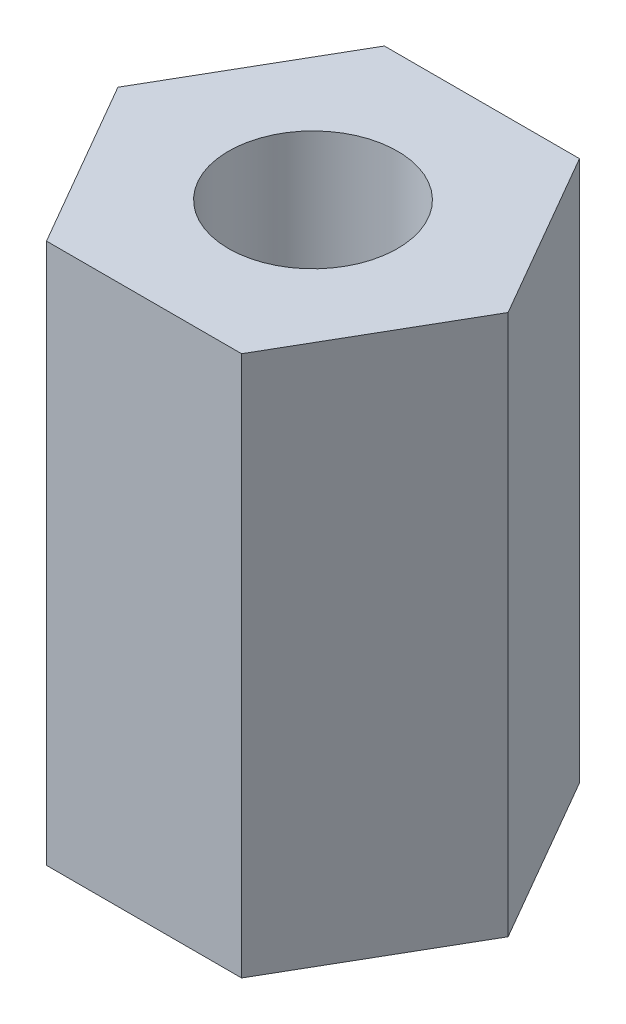
ISO-10303-21;
HEADER;
FILE_DESCRIPTION(('STEP AP214'),'2;1');
FILE_NAME('part.step','',(''),(''),'','','');
FILE_SCHEMA(('AUTOMOTIVE_DESIGN { 1 0 10303 214 1 1 1 1 }'));
ENDSEC;
DATA;
#1=APPLICATION_CONTEXT('core data for automotive mechanical design processes');
#2=APPLICATION_PROTOCOL_DEFINITION('international standard','automotive_design',2000,#1);
#3=PRODUCT_CONTEXT('',#1,'mechanical');
#4=PRODUCT('Part','Part','',(#3));
#5=PRODUCT_RELATED_PRODUCT_CATEGORY('part','',(#4));
#6=PRODUCT_DEFINITION_FORMATION('','',#4);
#7=PRODUCT_DEFINITION_CONTEXT('part definition',#1,'design');
#8=PRODUCT_DEFINITION('design','',#6,#7);
#9=PRODUCT_DEFINITION_SHAPE('','',#8);
#10=(LENGTH_UNIT() NAMED_UNIT(*) SI_UNIT(.MILLI.,.METRE.));
#11=(NAMED_UNIT(*) PLANE_ANGLE_UNIT() SI_UNIT($,.RADIAN.));
#12=(NAMED_UNIT(*) SI_UNIT($,.STERADIAN.) SOLID_ANGLE_UNIT());
#13=UNCERTAINTY_MEASURE_WITH_UNIT(LENGTH_MEASURE(1.E-05),#10,'distance_accuracy_value','');
#14=(GEOMETRIC_REPRESENTATION_CONTEXT(3) GLOBAL_UNCERTAINTY_ASSIGNED_CONTEXT((#13)) GLOBAL_UNIT_ASSIGNED_CONTEXT((#10,
#11,#12)) REPRESENTATION_CONTEXT('',''));
#15=CARTESIAN_POINT('',(0.,0.,0.));
#16=DIRECTION('',(0.,0.,1.));
#17=DIRECTION('',(1.,0.,0.));
#18=AXIS2_PLACEMENT_3D('',#15,#16,#17);
#19=CARTESIAN_POINT('',(0.,8.,0.));
#20=DIRECTION('',(0.,1.,0.));
#21=DIRECTION('',(0.,0.,1.));
#22=AXIS2_PLACEMENT_3D('',#19,#20,#21);
#23=PLANE('',#22);
#24=DIRECTION('',(1.,0.,0.));
#25=VECTOR('',#24,1.);
#26=CARTESIAN_POINT('',(-1.44337567297406,8.,2.5));
#27=LINE('',#26,#25);
#28=CARTESIAN_POINT('',(-1.44337567297406,8.,2.5));
#29=VERTEX_POINT('',#28);
#30=CARTESIAN_POINT('',(1.44337567297406,8.,2.5));
#31=VERTEX_POINT('',#30);
#32=EDGE_CURVE('E134',#29,#31,#27,.T.);
#33=ORIENTED_EDGE('',*,*,#32,.T.);
#34=DIRECTION('',(0.5,0.,-0.866025403784439));
#35=VECTOR('',#34,1.);
#36=CARTESIAN_POINT('',(1.44337567297406,8.,2.5));
#37=LINE('',#36,#35);
#38=CARTESIAN_POINT('',(2.88675134594813,8.,0.));
#39=VERTEX_POINT('',#38);
#40=EDGE_CURVE('E92',#31,#39,#37,.T.);
#41=ORIENTED_EDGE('',*,*,#40,.T.);
#42=DIRECTION('',(-0.5,0.,-0.866025403784438));
#43=VECTOR('',#42,1.);
#44=CARTESIAN_POINT('',(2.88675134594813,8.,0.));
#45=LINE('',#44,#43);
#46=CARTESIAN_POINT('',(1.44337567297406,8.,-2.5));
#47=VERTEX_POINT('',#46);
#48=EDGE_CURVE('E105',#39,#47,#45,.T.);
#49=ORIENTED_EDGE('',*,*,#48,.T.);
#50=DIRECTION('',(-1.,0.,0.));
#51=VECTOR('',#50,1.);
#52=CARTESIAN_POINT('',(1.44337567297406,8.,-2.5));
#53=LINE('',#52,#51);
#54=CARTESIAN_POINT('',(-1.44337567297406,8.,-2.5));
#55=VERTEX_POINT('',#54);
#56=EDGE_CURVE('E99',#47,#55,#53,.T.);
#57=ORIENTED_EDGE('',*,*,#56,.T.);
#58=DIRECTION('',(-0.5,0.,0.866025403784439));
#59=VECTOR('',#58,1.);
#60=CARTESIAN_POINT('',(-1.44337567297406,8.,-2.5));
#61=LINE('',#60,#59);
#62=CARTESIAN_POINT('',(-2.88675134594813,8.,0.));
#63=VERTEX_POINT('',#62);
#64=EDGE_CURVE('E103',#55,#63,#61,.T.);
#65=ORIENTED_EDGE('',*,*,#64,.T.);
#66=DIRECTION('',(0.5,0.,0.866025403784438));
#67=VECTOR('',#66,1.);
#68=CARTESIAN_POINT('',(-2.88675134594813,8.,0.));
#69=LINE('',#68,#67);
#70=EDGE_CURVE('E55',#63,#29,#69,.T.);
#71=ORIENTED_EDGE('',*,*,#70,.T.);
#72=EDGE_LOOP('',(#33,#41,#49,#57,#65,#71));
#73=FACE_BOUND('',#72,.T.);
#74=CARTESIAN_POINT('',(0.,8.,0.));
#75=DIRECTION('',(0.,1.,0.));
#76=DIRECTION('',(0.,0.,1.));
#77=AXIS2_PLACEMENT_3D('',#74,#75,#76);
#78=CIRCLE('',#77,1.25);
#79=CARTESIAN_POINT('',(0.,8.,1.25));
#80=VERTEX_POINT('',#79);
#81=EDGE_CURVE('E127',#80,#80,#78,.T.);
#82=ORIENTED_EDGE('',*,*,#81,.F.);
#83=EDGE_LOOP('',(#82));
#84=FACE_BOUND('',#83,.T.);
#85=ADVANCED_FACE('F38',(#73,#84),#23,.T.);
#86=CARTESIAN_POINT('',(0.,0.,0.));
#87=DIRECTION('',(0.,1.,0.));
#88=DIRECTION('',(0.,0.,1.));
#89=AXIS2_PLACEMENT_3D('',#86,#87,#88);
#90=PLANE('',#89);
#91=DIRECTION('',(1.,0.,0.));
#92=VECTOR('',#91,1.);
#93=CARTESIAN_POINT('',(-1.44337567297406,0.,2.5));
#94=LINE('',#93,#92);
#95=CARTESIAN_POINT('',(-1.44337567297406,0.,2.5));
#96=VERTEX_POINT('',#95);
#97=CARTESIAN_POINT('',(1.44337567297406,0.,2.5));
#98=VERTEX_POINT('',#97);
#99=EDGE_CURVE('E123',#96,#98,#94,.T.);
#100=ORIENTED_EDGE('',*,*,#99,.F.);
#101=DIRECTION('',(0.5,0.,0.866025403784438));
#102=VECTOR('',#101,1.);
#103=CARTESIAN_POINT('',(-2.88675134594813,0.,0.));
#104=LINE('',#103,#102);
#105=CARTESIAN_POINT('',(-2.88675134594813,0.,0.));
#106=VERTEX_POINT('',#105);
#107=EDGE_CURVE('E84',#106,#96,#104,.T.);
#108=ORIENTED_EDGE('',*,*,#107,.F.);
#109=DIRECTION('',(-0.5,0.,0.866025403784439));
#110=VECTOR('',#109,1.);
#111=CARTESIAN_POINT('',(-1.44337567297406,0.,-2.5));
#112=LINE('',#111,#110);
#113=CARTESIAN_POINT('',(-1.44337567297406,0.,-2.5));
#114=VERTEX_POINT('',#113);
#115=EDGE_CURVE('E78',#114,#106,#112,.T.);
#116=ORIENTED_EDGE('',*,*,#115,.F.);
#117=DIRECTION('',(-1.,0.,0.));
#118=VECTOR('',#117,1.);
#119=CARTESIAN_POINT('',(1.44337567297406,0.,-2.5));
#120=LINE('',#119,#118);
#121=CARTESIAN_POINT('',(1.44337567297406,0.,-2.5));
#122=VERTEX_POINT('',#121);
#123=EDGE_CURVE('E113',#122,#114,#120,.T.);
#124=ORIENTED_EDGE('',*,*,#123,.F.);
#125=DIRECTION('',(-0.5,0.,-0.866025403784438));
#126=VECTOR('',#125,1.);
#127=CARTESIAN_POINT('',(2.88675134594813,0.,0.));
#128=LINE('',#127,#126);
#129=CARTESIAN_POINT('',(2.88675134594813,0.,0.));
#130=VERTEX_POINT('',#129);
#131=EDGE_CURVE('E129',#130,#122,#128,.T.);
#132=ORIENTED_EDGE('',*,*,#131,.F.);
#133=DIRECTION('',(0.5,0.,-0.866025403784439));
#134=VECTOR('',#133,1.);
#135=CARTESIAN_POINT('',(1.44337567297406,0.,2.5));
#136=LINE('',#135,#134);
#137=EDGE_CURVE('E126',#98,#130,#136,.T.);
#138=ORIENTED_EDGE('',*,*,#137,.F.);
#139=EDGE_LOOP('',(#100,#108,#116,#124,#132,#138));
#140=FACE_BOUND('',#139,.T.);
#141=CARTESIAN_POINT('',(0.,0.,0.));
#142=DIRECTION('',(0.,1.,0.));
#143=DIRECTION('',(0.,0.,1.));
#144=AXIS2_PLACEMENT_3D('',#141,#142,#143);
#145=CIRCLE('',#144,1.25);
#146=CARTESIAN_POINT('',(0.,0.,1.25));
#147=VERTEX_POINT('',#146);
#148=EDGE_CURVE('E245',#147,#147,#145,.T.);
#149=ORIENTED_EDGE('',*,*,#148,.T.);
#150=EDGE_LOOP('',(#149));
#151=FACE_BOUND('',#150,.T.);
#152=ADVANCED_FACE('F143',(#140,#151),#90,.F.);
#153=CARTESIAN_POINT('',(-1.44337567297406,8.,2.5));
#154=DIRECTION('',(0.,0.,-1.));
#155=DIRECTION('',(-1.,0.,0.));
#156=AXIS2_PLACEMENT_3D('',#153,#154,#155);
#157=PLANE('',#156);
#158=ORIENTED_EDGE('',*,*,#99,.T.);
#159=DIRECTION('',(0.,-1.,0.));
#160=VECTOR('',#159,1.);
#161=CARTESIAN_POINT('',(1.44337567297406,8.,2.5));
#162=LINE('',#161,#160);
#163=EDGE_CURVE('E11',#31,#98,#162,.T.);
#164=ORIENTED_EDGE('',*,*,#163,.F.);
#165=ORIENTED_EDGE('',*,*,#32,.F.);
#166=DIRECTION('',(0.,-1.,0.));
#167=VECTOR('',#166,1.);
#168=CARTESIAN_POINT('',(-1.44337567297406,8.,2.5));
#169=LINE('',#168,#167);
#170=EDGE_CURVE('E119',#29,#96,#169,.T.);
#171=ORIENTED_EDGE('',*,*,#170,.T.);
#172=EDGE_LOOP('',(#158,#164,#165,#171));
#173=FACE_BOUND('',#172,.T.);
#174=ADVANCED_FACE('F40',(#173),#157,.F.);
#175=CARTESIAN_POINT('',(1.44337567297406,8.,2.5));
#176=DIRECTION('',(-0.866025403784439,0.,-0.5));
#177=DIRECTION('',(-0.5,0.,0.866025403784439));
#178=AXIS2_PLACEMENT_3D('',#175,#176,#177);
#179=PLANE('',#178);
#180=ORIENTED_EDGE('',*,*,#137,.T.);
#181=DIRECTION('',(0.,-1.,0.));
#182=VECTOR('',#181,1.);
#183=CARTESIAN_POINT('',(2.88675134594813,8.,0.));
#184=LINE('',#183,#182);
#185=EDGE_CURVE('E47',#39,#130,#184,.T.);
#186=ORIENTED_EDGE('',*,*,#185,.F.);
#187=ORIENTED_EDGE('',*,*,#40,.F.);
#188=ORIENTED_EDGE('',*,*,#163,.T.);
#189=EDGE_LOOP('',(#180,#186,#187,#188));
#190=FACE_BOUND('',#189,.T.);
#191=ADVANCED_FACE('F168',(#190),#179,.F.);
#192=CARTESIAN_POINT('',(2.88675134594813,8.,0.));
#193=DIRECTION('',(-0.866025403784438,0.,0.5));
#194=DIRECTION('',(0.5,0.,0.866025403784438));
#195=AXIS2_PLACEMENT_3D('',#192,#193,#194);
#196=PLANE('',#195);
#197=ORIENTED_EDGE('',*,*,#131,.T.);
#198=DIRECTION('',(0.,-1.,0.));
#199=VECTOR('',#198,1.);
#200=CARTESIAN_POINT('',(1.44337567297406,8.,-2.5));
#201=LINE('',#200,#199);
#202=EDGE_CURVE('E114',#47,#122,#201,.T.);
#203=ORIENTED_EDGE('',*,*,#202,.F.);
#204=ORIENTED_EDGE('',*,*,#48,.F.);
#205=ORIENTED_EDGE('',*,*,#185,.T.);
#206=EDGE_LOOP('',(#197,#203,#204,#205));
#207=FACE_BOUND('',#206,.T.);
#208=ADVANCED_FACE('F140',(#207),#196,.F.);
#209=CARTESIAN_POINT('',(1.44337567297406,8.,-2.5));
#210=DIRECTION('',(0.,0.,1.));
#211=DIRECTION('',(1.,0.,0.));
#212=AXIS2_PLACEMENT_3D('',#209,#210,#211);
#213=PLANE('',#212);
#214=ORIENTED_EDGE('',*,*,#123,.T.);
#215=DIRECTION('',(0.,-1.,0.));
#216=VECTOR('',#215,1.);
#217=CARTESIAN_POINT('',(-1.44337567297406,8.,-2.5));
#218=LINE('',#217,#216);
#219=EDGE_CURVE('E110',#55,#114,#218,.T.);
#220=ORIENTED_EDGE('',*,*,#219,.F.);
#221=ORIENTED_EDGE('',*,*,#56,.F.);
#222=ORIENTED_EDGE('',*,*,#202,.T.);
#223=EDGE_LOOP('',(#214,#220,#221,#222));
#224=FACE_BOUND('',#223,.T.);
#225=ADVANCED_FACE('F111',(#224),#213,.F.);
#226=CARTESIAN_POINT('',(-1.44337567297406,8.,-2.5));
#227=DIRECTION('',(0.866025403784439,0.,0.5));
#228=DIRECTION('',(0.5,0.,-0.866025403784439));
#229=AXIS2_PLACEMENT_3D('',#226,#227,#228);
#230=PLANE('',#229);
#231=ORIENTED_EDGE('',*,*,#115,.T.);
#232=DIRECTION('',(0.,-1.,0.));
#233=VECTOR('',#232,1.);
#234=CARTESIAN_POINT('',(-2.88675134594813,8.,0.));
#235=LINE('',#234,#233);
#236=EDGE_CURVE('E115',#63,#106,#235,.T.);
#237=ORIENTED_EDGE('',*,*,#236,.F.);
#238=ORIENTED_EDGE('',*,*,#64,.F.);
#239=ORIENTED_EDGE('',*,*,#219,.T.);
#240=EDGE_LOOP('',(#231,#237,#238,#239));
#241=FACE_BOUND('',#240,.T.);
#242=ADVANCED_FACE('F117',(#241),#230,.F.);
#243=CARTESIAN_POINT('',(-2.88675134594813,8.,0.));
#244=DIRECTION('',(0.866025403784438,0.,-0.5));
#245=DIRECTION('',(-0.5,0.,-0.866025403784439));
#246=AXIS2_PLACEMENT_3D('',#243,#244,#245);
#247=PLANE('',#246);
#248=ORIENTED_EDGE('',*,*,#107,.T.);
#249=ORIENTED_EDGE('',*,*,#170,.F.);
#250=ORIENTED_EDGE('',*,*,#70,.F.);
#251=ORIENTED_EDGE('',*,*,#236,.T.);
#252=EDGE_LOOP('',(#248,#249,#250,#251));
#253=FACE_BOUND('',#252,.T.);
#254=ADVANCED_FACE('F148',(#253),#247,.F.);
#255=CARTESIAN_POINT('',(0.,8.,0.));
#256=DIRECTION('',(0.,-1.,0.));
#257=DIRECTION('',(0.,0.,-1.));
#258=AXIS2_PLACEMENT_3D('',#255,#256,#257);
#259=CYLINDRICAL_SURFACE('',#258,1.25);
#260=ORIENTED_EDGE('',*,*,#81,.T.);
#261=EDGE_LOOP('',(#260));
#262=FACE_BOUND('',#261,.T.);
#263=ORIENTED_EDGE('',*,*,#148,.F.);
#264=EDGE_LOOP('',(#263));
#265=FACE_BOUND('',#264,.T.);
#266=ADVANCED_FACE('F150',(#262,#265),#259,.F.);
#267=CLOSED_SHELL('',(#85,#152,#174,#191,#208,#225,#242,#254,#266));
#268=MANIFOLD_SOLID_BREP('B2',#267);
#269=ADVANCED_BREP_SHAPE_REPRESENTATION('',(#18,#268),#14);
#270=SHAPE_DEFINITION_REPRESENTATION(#9,#269);
ENDSEC;
END-ISO-10303-21;
